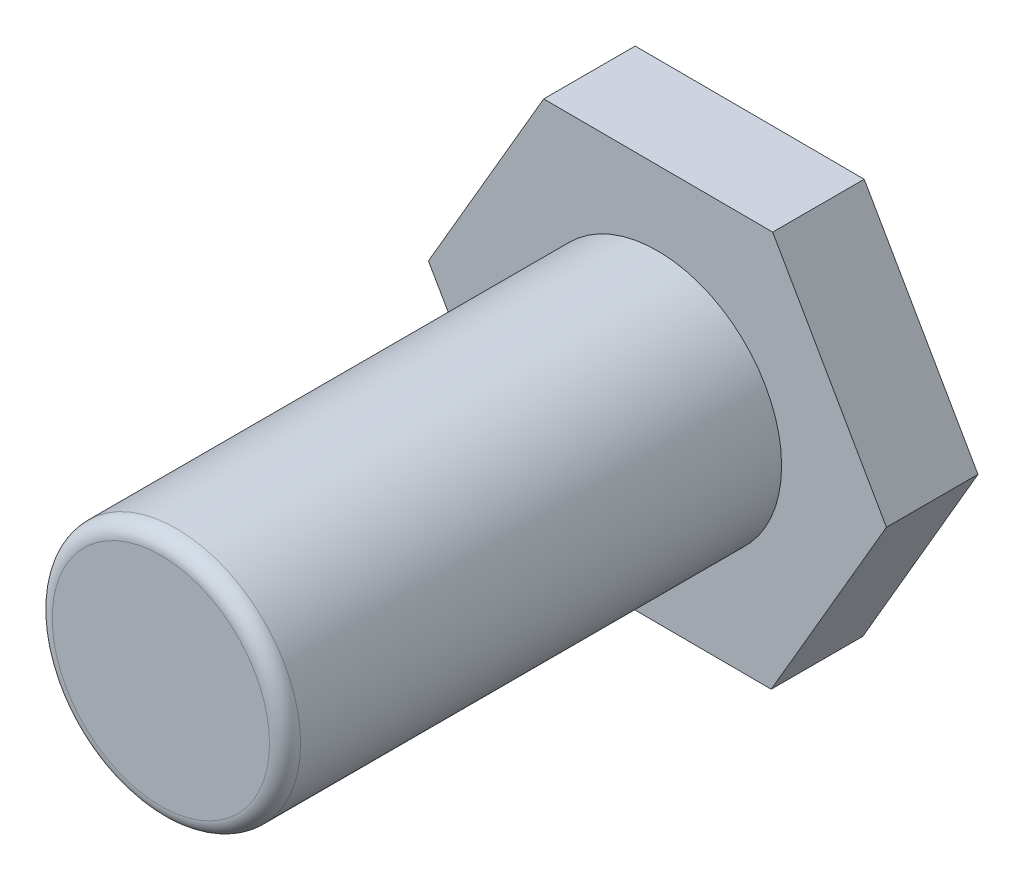
ISO-10303-21;
HEADER;
FILE_DESCRIPTION(('STEP AP214'),'2;1');
FILE_NAME('part.step','',(''),(''),'','','');
FILE_SCHEMA(('AUTOMOTIVE_DESIGN { 1 0 10303 214 1 1 1 1 }'));
ENDSEC;
DATA;
#1=APPLICATION_CONTEXT('core data for automotive mechanical design processes');
#2=APPLICATION_PROTOCOL_DEFINITION('international standard','automotive_design',2000,#1);
#3=PRODUCT_CONTEXT('',#1,'mechanical');
#4=PRODUCT('Part','Part','',(#3));
#5=PRODUCT_RELATED_PRODUCT_CATEGORY('part','',(#4));
#6=PRODUCT_DEFINITION_FORMATION('','',#4);
#7=PRODUCT_DEFINITION_CONTEXT('part definition',#1,'design');
#8=PRODUCT_DEFINITION('design','',#6,#7);
#9=PRODUCT_DEFINITION_SHAPE('','',#8);
#10=(LENGTH_UNIT() NAMED_UNIT(*) SI_UNIT(.MILLI.,.METRE.));
#11=(NAMED_UNIT(*) PLANE_ANGLE_UNIT() SI_UNIT($,.RADIAN.));
#12=(NAMED_UNIT(*) SI_UNIT($,.STERADIAN.) SOLID_ANGLE_UNIT());
#13=UNCERTAINTY_MEASURE_WITH_UNIT(LENGTH_MEASURE(1.E-05),#10,'distance_accuracy_value','');
#14=(GEOMETRIC_REPRESENTATION_CONTEXT(3) GLOBAL_UNCERTAINTY_ASSIGNED_CONTEXT((#13)) GLOBAL_UNIT_ASSIGNED_CONTEXT((#10,
#11,#12)) REPRESENTATION_CONTEXT('',''));
#15=CARTESIAN_POINT('',(0.,0.,0.));
#16=DIRECTION('',(0.,0.,1.));
#17=DIRECTION('',(1.,0.,0.));
#18=AXIS2_PLACEMENT_3D('',#15,#16,#17);
#19=CARTESIAN_POINT('',(7.37848609582734,-0.0272568098377505,2.95000000000004));
#20=DIRECTION('',(-0.867866528441833,-0.496797432370902,0.));
#21=DIRECTION('',(0.496797432370902,-0.867866528441834,0.));
#22=AXIS2_PLACEMENT_3D('',#19,#20,#21);
#23=PLANE('',#22);
#24=DIRECTION('',(-0.496797432370902,0.867866528441834,0.));
#25=VECTOR('',#24,1.);
#26=CARTESIAN_POINT('',(7.37848609582734,-0.0272568098377453,0.));
#27=LINE('',#26,#25);
#28=CARTESIAN_POINT('',(7.37848609582734,-0.0272568098377453,0.));
#29=VERTEX_POINT('',#28);
#30=CARTESIAN_POINT('',(3.71284813765929,6.37632799553788,0.));
#31=VERTEX_POINT('',#30);
#32=EDGE_CURVE('E138',#29,#31,#27,.T.);
#33=ORIENTED_EDGE('',*,*,#32,.T.);
#34=DIRECTION('',(0.,0.,-1.));
#35=VECTOR('',#34,1.);
#36=CARTESIAN_POINT('',(3.71284813765929,6.37632799553786,2.95000000000001));
#37=LINE('',#36,#35);
#38=CARTESIAN_POINT('',(3.71284813765929,6.37632799553786,2.95000000000001));
#39=VERTEX_POINT('',#38);
#40=EDGE_CURVE('E155',#39,#31,#37,.T.);
#41=ORIENTED_EDGE('',*,*,#40,.F.);
#42=DIRECTION('',(-0.496797432370902,0.867866528441834,0.));
#43=VECTOR('',#42,1.);
#44=CARTESIAN_POINT('',(7.37848609582734,-0.0272568098377505,2.95000000000004));
#45=LINE('',#44,#43);
#46=CARTESIAN_POINT('',(7.37848609582734,-0.0272568098377505,2.95000000000004));
#47=VERTEX_POINT('',#46);
#48=EDGE_CURVE('E148',#47,#39,#45,.T.);
#49=ORIENTED_EDGE('',*,*,#48,.F.);
#50=DIRECTION('',(0.,0.,-1.));
#51=VECTOR('',#50,1.);
#52=CARTESIAN_POINT('',(7.37848609582734,-0.0272568098377505,2.95000000000004));
#53=LINE('',#52,#51);
#54=EDGE_CURVE('E134',#47,#29,#53,.T.);
#55=ORIENTED_EDGE('',*,*,#54,.T.);
#56=EDGE_LOOP('',(#33,#41,#49,#55));
#57=FACE_BOUND('',#56,.T.);
#58=ADVANCED_FACE('F52',(#57),#23,.F.);
#59=CARTESIAN_POINT('',(3.71284813765929,6.37632799553786,2.95000000000001));
#60=DIRECTION('',(-0.00369406725283444,-0.99999317691029,0.));
#61=DIRECTION('',(0.999993176910288,-0.00369406725283444,0.));
#62=AXIS2_PLACEMENT_3D('',#59,#60,#61);
#63=PLANE('',#62);
#64=DIRECTION('',(-0.999993176910288,0.00369406725283444,0.));
#65=VECTOR('',#64,1.);
#66=CARTESIAN_POINT('',(3.71284813765929,6.37632799553788,0.));
#67=LINE('',#66,#65);
#68=CARTESIAN_POINT('',(-3.66563795816807,6.40358480537562,0.));
#69=VERTEX_POINT('',#68);
#70=EDGE_CURVE('E141',#31,#69,#67,.T.);
#71=ORIENTED_EDGE('',*,*,#70,.T.);
#72=DIRECTION('',(0.,0.,-1.));
#73=VECTOR('',#72,1.);
#74=CARTESIAN_POINT('',(-3.66563795816809,6.40358480537562,2.95000000000001));
#75=LINE('',#74,#73);
#76=CARTESIAN_POINT('',(-3.66563795816809,6.40358480537562,2.95000000000001));
#77=VERTEX_POINT('',#76);
#78=EDGE_CURVE('E152',#77,#69,#75,.T.);
#79=ORIENTED_EDGE('',*,*,#78,.F.);
#80=DIRECTION('',(-0.999993176910288,0.00369406725283444,0.));
#81=VECTOR('',#80,1.);
#82=CARTESIAN_POINT('',(3.71284813765929,6.37632799553786,2.95000000000001));
#83=LINE('',#82,#81);
#84=EDGE_CURVE('E107',#39,#77,#83,.T.);
#85=ORIENTED_EDGE('',*,*,#84,.F.);
#86=ORIENTED_EDGE('',*,*,#40,.T.);
#87=EDGE_LOOP('',(#71,#79,#85,#86));
#88=FACE_BOUND('',#87,.T.);
#89=ADVANCED_FACE('F168',(#88),#63,.F.);
#90=CARTESIAN_POINT('',(-3.66563795816809,6.40358480537562,2.95000000000001));
#91=DIRECTION('',(0.864172461188998,-0.503195744539387,0.));
#92=DIRECTION('',(0.503195744539386,0.864172461189,0.));
#93=AXIS2_PLACEMENT_3D('',#90,#91,#92);
#94=PLANE('',#93);
#95=DIRECTION('',(-0.503195744539387,-0.864172461189,0.));
#96=VECTOR('',#95,1.);
#97=CARTESIAN_POINT('',(-3.66563795816807,6.40358480537562,0.));
#98=LINE('',#97,#96);
#99=CARTESIAN_POINT('',(-7.37848609582735,0.0272568098377453,0.));
#100=VERTEX_POINT('',#99);
#101=EDGE_CURVE('E143',#69,#100,#98,.T.);
#102=ORIENTED_EDGE('',*,*,#101,.T.);
#103=DIRECTION('',(0.,0.,-1.));
#104=VECTOR('',#103,1.);
#105=CARTESIAN_POINT('',(-7.37848609582734,0.0272568098377401,2.95000000000001));
#106=LINE('',#105,#104);
#107=CARTESIAN_POINT('',(-7.37848609582734,0.0272568098377401,2.95000000000001));
#108=VERTEX_POINT('',#107);
#109=EDGE_CURVE('E129',#108,#100,#106,.T.);
#110=ORIENTED_EDGE('',*,*,#109,.F.);
#111=DIRECTION('',(-0.503195744539387,-0.864172461189,0.));
#112=VECTOR('',#111,1.);
#113=CARTESIAN_POINT('',(-3.66563795816809,6.40358480537562,2.95000000000001));
#114=LINE('',#113,#112);
#115=EDGE_CURVE('E120',#77,#108,#114,.T.);
#116=ORIENTED_EDGE('',*,*,#115,.F.);
#117=ORIENTED_EDGE('',*,*,#78,.T.);
#118=EDGE_LOOP('',(#102,#110,#116,#117));
#119=FACE_BOUND('',#118,.T.);
#120=ADVANCED_FACE('F171',(#119),#94,.F.);
#121=CARTESIAN_POINT('',(-7.37848609582734,0.0272568098377401,2.95000000000001));
#122=DIRECTION('',(0.867866528441833,0.496797432370902,0.));
#123=DIRECTION('',(-0.496797432370902,0.867866528441834,0.));
#124=AXIS2_PLACEMENT_3D('',#121,#122,#123);
#125=PLANE('',#124);
#126=DIRECTION('',(0.496797432370902,-0.867866528441834,0.));
#127=VECTOR('',#126,1.);
#128=CARTESIAN_POINT('',(-7.37848609582735,0.0272568098377453,0.));
#129=LINE('',#128,#127);
#130=CARTESIAN_POINT('',(-3.7128481376593,-6.37632799553788,0.));
#131=VERTEX_POINT('',#130);
#132=EDGE_CURVE('E128',#100,#131,#129,.T.);
#133=ORIENTED_EDGE('',*,*,#132,.T.);
#134=DIRECTION('',(0.,0.,-1.));
#135=VECTOR('',#134,1.);
#136=CARTESIAN_POINT('',(-3.71284813765928,-6.37632799553789,2.95000000000004));
#137=LINE('',#136,#135);
#138=CARTESIAN_POINT('',(-3.71284813765928,-6.37632799553789,2.95000000000004));
#139=VERTEX_POINT('',#138);
#140=EDGE_CURVE('E125',#139,#131,#137,.T.);
#141=ORIENTED_EDGE('',*,*,#140,.F.);
#142=DIRECTION('',(0.496797432370902,-0.867866528441834,0.));
#143=VECTOR('',#142,1.);
#144=CARTESIAN_POINT('',(-7.37848609582734,0.0272568098377401,2.95000000000001));
#145=LINE('',#144,#143);
#146=EDGE_CURVE('E114',#108,#139,#145,.T.);
#147=ORIENTED_EDGE('',*,*,#146,.F.);
#148=ORIENTED_EDGE('',*,*,#109,.T.);
#149=EDGE_LOOP('',(#133,#141,#147,#148));
#150=FACE_BOUND('',#149,.T.);
#151=ADVANCED_FACE('F126',(#150),#125,.F.);
#152=CARTESIAN_POINT('',(-3.71284813765928,-6.37632799553789,2.95000000000004));
#153=DIRECTION('',(0.00369406725283361,0.999993176910289,0.));
#154=DIRECTION('',(-0.999993176910288,0.00369406725283367,0.));
#155=AXIS2_PLACEMENT_3D('',#152,#153,#154);
#156=PLANE('',#155);
#157=DIRECTION('',(0.999993176910288,-0.00369406725283367,0.));
#158=VECTOR('',#157,1.);
#159=CARTESIAN_POINT('',(-3.7128481376593,-6.37632799553788,0.));
#160=LINE('',#159,#158);
#161=CARTESIAN_POINT('',(3.66563795816804,-6.40358480537562,0.));
#162=VERTEX_POINT('',#161);
#163=EDGE_CURVE('E92',#131,#162,#160,.T.);
#164=ORIENTED_EDGE('',*,*,#163,.T.);
#165=DIRECTION('',(0.,0.,-1.));
#166=VECTOR('',#165,1.);
#167=CARTESIAN_POINT('',(3.66563795816807,-6.40358480537562,2.95000000000001));
#168=LINE('',#167,#166);
#169=CARTESIAN_POINT('',(3.66563795816807,-6.40358480537562,2.95000000000001));
#170=VERTEX_POINT('',#169);
#171=EDGE_CURVE('E130',#170,#162,#168,.T.);
#172=ORIENTED_EDGE('',*,*,#171,.F.);
#173=DIRECTION('',(0.999993176910288,-0.00369406725283367,0.));
#174=VECTOR('',#173,1.);
#175=CARTESIAN_POINT('',(-3.71284813765928,-6.37632799553789,2.95000000000004));
#176=LINE('',#175,#174);
#177=EDGE_CURVE('E118',#139,#170,#176,.T.);
#178=ORIENTED_EDGE('',*,*,#177,.F.);
#179=ORIENTED_EDGE('',*,*,#140,.T.);
#180=EDGE_LOOP('',(#164,#172,#178,#179));
#181=FACE_BOUND('',#180,.T.);
#182=ADVANCED_FACE('F132',(#181),#156,.F.);
#183=CARTESIAN_POINT('',(3.66563795816807,-6.40358480537562,2.95000000000001));
#184=DIRECTION('',(-0.864172461188998,0.503195744539387,0.));
#185=DIRECTION('',(-0.503195744539387,-0.864172461189,0.));
#186=AXIS2_PLACEMENT_3D('',#183,#184,#185);
#187=PLANE('',#186);
#188=DIRECTION('',(0.503195744539387,0.864172461189,0.));
#189=VECTOR('',#188,1.);
#190=CARTESIAN_POINT('',(3.66563795816804,-6.40358480537562,0.));
#191=LINE('',#190,#189);
#192=EDGE_CURVE('E98',#162,#29,#191,.T.);
#193=ORIENTED_EDGE('',*,*,#192,.T.);
#194=ORIENTED_EDGE('',*,*,#54,.F.);
#195=DIRECTION('',(0.503195744539387,0.864172461189,0.));
#196=VECTOR('',#195,1.);
#197=CARTESIAN_POINT('',(3.66563795816807,-6.40358480537562,2.95000000000001));
#198=LINE('',#197,#196);
#199=EDGE_CURVE('E69',#170,#47,#198,.T.);
#200=ORIENTED_EDGE('',*,*,#199,.F.);
#201=ORIENTED_EDGE('',*,*,#171,.T.);
#202=EDGE_LOOP('',(#193,#194,#200,#201));
#203=FACE_BOUND('',#202,.T.);
#204=ADVANCED_FACE('F176',(#203),#187,.F.);
#205=CARTESIAN_POINT('',(0.,0.,2.95000000000004));
#206=DIRECTION('',(0.,0.,1.));
#207=DIRECTION('',(1.,0.,0.));
#208=AXIS2_PLACEMENT_3D('',#205,#206,#207);
#209=PLANE('',#208);
#210=CARTESIAN_POINT('',(0.,0.,2.95000000000004));
#211=DIRECTION('',(0.,0.,1.));
#212=DIRECTION('',(1.,0.,0.));
#213=AXIS2_PLACEMENT_3D('',#210,#211,#212);
#214=CIRCLE('',#213,4.);
#215=CARTESIAN_POINT('',(3.99999999999999,0.,2.95000000000004));
#216=VERTEX_POINT('',#215);
#217=EDGE_CURVE('E156',#216,#216,#214,.T.);
#218=ORIENTED_EDGE('',*,*,#217,.F.);
#219=EDGE_LOOP('',(#218));
#220=FACE_BOUND('',#219,.T.);
#221=ORIENTED_EDGE('',*,*,#48,.T.);
#222=ORIENTED_EDGE('',*,*,#84,.T.);
#223=ORIENTED_EDGE('',*,*,#115,.T.);
#224=ORIENTED_EDGE('',*,*,#146,.T.);
#225=ORIENTED_EDGE('',*,*,#177,.T.);
#226=ORIENTED_EDGE('',*,*,#199,.T.);
#227=EDGE_LOOP('',(#221,#222,#223,#224,#225,#226));
#228=FACE_BOUND('',#227,.T.);
#229=ADVANCED_FACE('F116',(#220,#228),#209,.T.);
#230=CARTESIAN_POINT('',(0.,0.,0.));
#231=DIRECTION('',(0.,0.,1.));
#232=DIRECTION('',(1.,0.,0.));
#233=AXIS2_PLACEMENT_3D('',#230,#231,#232);
#234=PLANE('',#233);
#235=ORIENTED_EDGE('',*,*,#32,.F.);
#236=ORIENTED_EDGE('',*,*,#192,.F.);
#237=ORIENTED_EDGE('',*,*,#163,.F.);
#238=ORIENTED_EDGE('',*,*,#132,.F.);
#239=ORIENTED_EDGE('',*,*,#101,.F.);
#240=ORIENTED_EDGE('',*,*,#70,.F.);
#241=EDGE_LOOP('',(#235,#236,#237,#238,#239,#240));
#242=FACE_BOUND('',#241,.T.);
#243=ADVANCED_FACE('F174',(#242),#234,.F.);
#244=CARTESIAN_POINT('',(0.,0.,18.95));
#245=DIRECTION('',(0.,0.,-1.));
#246=DIRECTION('',(-1.,0.,0.));
#247=AXIS2_PLACEMENT_3D('',#244,#245,#246);
#248=CYLINDRICAL_SURFACE('',#247,4.);
#249=CARTESIAN_POINT('',(0.,0.,18.45));
#250=DIRECTION('',(0.,0.,1.));
#251=DIRECTION('',(1.,0.,0.));
#252=AXIS2_PLACEMENT_3D('',#249,#250,#251);
#253=CIRCLE('',#252,4.);
#254=CARTESIAN_POINT('',(3.99999999999998,0.,18.45));
#255=VERTEX_POINT('',#254);
#256=EDGE_CURVE('E13',#255,#255,#253,.F.);
#257=ORIENTED_EDGE('',*,*,#256,.T.);
#258=EDGE_LOOP('',(#257));
#259=FACE_BOUND('',#258,.T.);
#260=ORIENTED_EDGE('',*,*,#217,.T.);
#261=EDGE_LOOP('',(#260));
#262=FACE_BOUND('',#261,.T.);
#263=ADVANCED_FACE('F223',(#259,#262),#248,.T.);
#264=CARTESIAN_POINT('',(0.,0.,18.95));
#265=DIRECTION('',(0.,0.,1.));
#266=DIRECTION('',(1.,0.,0.));
#267=AXIS2_PLACEMENT_3D('',#264,#265,#266);
#268=PLANE('',#267);
#269=CARTESIAN_POINT('',(0.,0.,18.95));
#270=DIRECTION('',(0.,0.,1.));
#271=DIRECTION('',(1.,0.,0.));
#272=AXIS2_PLACEMENT_3D('',#269,#270,#271);
#273=CIRCLE('',#272,3.5);
#274=CARTESIAN_POINT('',(3.49999999999998,0.,18.95));
#275=VERTEX_POINT('',#274);
#276=EDGE_CURVE('E61',#275,#275,#273,.T.);
#277=ORIENTED_EDGE('',*,*,#276,.T.);
#278=EDGE_LOOP('',(#277));
#279=FACE_BOUND('',#278,.T.);
#280=ADVANCED_FACE('F232',(#279),#268,.T.);
#281=CARTESIAN_POINT('',(0.,0.,18.45));
#282=DIRECTION('',(0.,0.,1.));
#283=DIRECTION('',(1.,0.,0.));
#284=AXIS2_PLACEMENT_3D('',#281,#282,#283);
#285=TOROIDAL_SURFACE('',#284,3.5,0.5);
#286=ORIENTED_EDGE('',*,*,#256,.F.);
#287=EDGE_LOOP('',(#286));
#288=FACE_BOUND('',#287,.T.);
#289=ORIENTED_EDGE('',*,*,#276,.F.);
#290=EDGE_LOOP('',(#289));
#291=FACE_BOUND('',#290,.T.);
#292=ADVANCED_FACE('F54',(#288,#291),#285,.T.);
#293=CLOSED_SHELL('',(#58,#89,#120,#151,#182,#204,#229,#243,#263,#280,#292));
#294=MANIFOLD_SOLID_BREP('B2',#293);
#295=ADVANCED_BREP_SHAPE_REPRESENTATION('',(#18,#294),#14);
#296=SHAPE_DEFINITION_REPRESENTATION(#9,#295);
ENDSEC;
END-ISO-10303-21;
